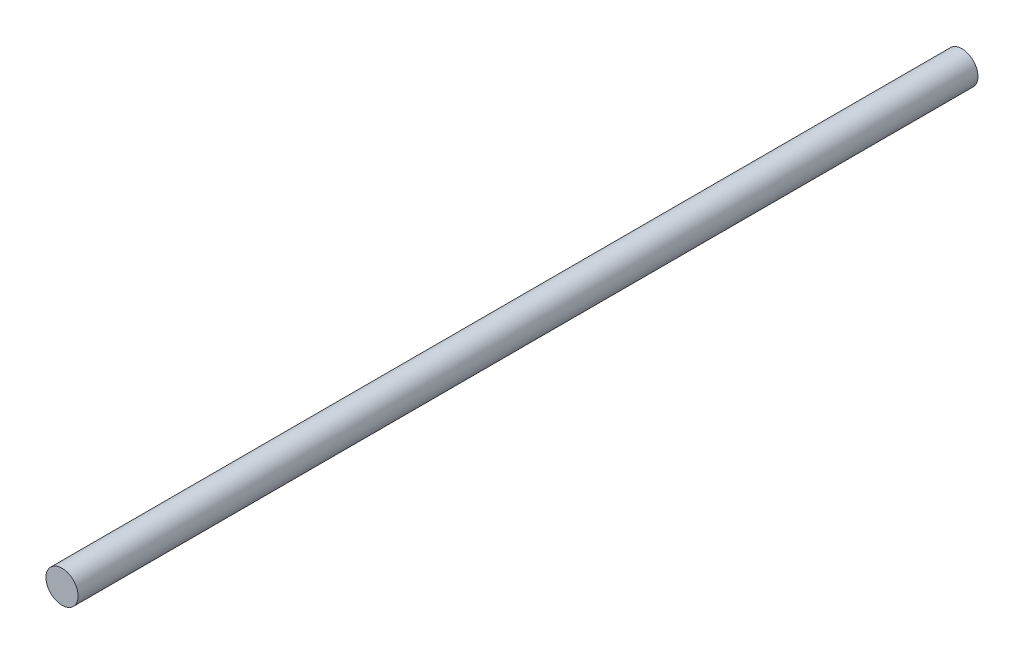
ISO-10303-21;
HEADER;
FILE_DESCRIPTION(('STEP AP214'),'2;1');
FILE_NAME('part.step','',(''),(''),'','','');
FILE_SCHEMA(('AUTOMOTIVE_DESIGN { 1 0 10303 214 1 1 1 1 }'));
ENDSEC;
DATA;
#1=APPLICATION_CONTEXT('core data for automotive mechanical design processes');
#2=APPLICATION_PROTOCOL_DEFINITION('international standard','automotive_design',2000,#1);
#3=PRODUCT_CONTEXT('',#1,'mechanical');
#4=PRODUCT('Part','Part','',(#3));
#5=PRODUCT_RELATED_PRODUCT_CATEGORY('part','',(#4));
#6=PRODUCT_DEFINITION_FORMATION('','',#4);
#7=PRODUCT_DEFINITION_CONTEXT('part definition',#1,'design');
#8=PRODUCT_DEFINITION('design','',#6,#7);
#9=PRODUCT_DEFINITION_SHAPE('','',#8);
#10=(LENGTH_UNIT() NAMED_UNIT(*) SI_UNIT(.MILLI.,.METRE.));
#11=(NAMED_UNIT(*) PLANE_ANGLE_UNIT() SI_UNIT($,.RADIAN.));
#12=(NAMED_UNIT(*) SI_UNIT($,.STERADIAN.) SOLID_ANGLE_UNIT());
#13=UNCERTAINTY_MEASURE_WITH_UNIT(LENGTH_MEASURE(1.E-05),#10,'distance_accuracy_value','');
#14=(GEOMETRIC_REPRESENTATION_CONTEXT(3) GLOBAL_UNCERTAINTY_ASSIGNED_CONTEXT((#13)) GLOBAL_UNIT_ASSIGNED_CONTEXT((#10,
#11,#12)) REPRESENTATION_CONTEXT('',''));
#15=CARTESIAN_POINT('',(0.,0.,0.));
#16=DIRECTION('',(0.,0.,1.));
#17=DIRECTION('',(1.,0.,0.));
#18=AXIS2_PLACEMENT_3D('',#15,#16,#17);
#19=CARTESIAN_POINT('',(-4.22656214703676,0.,140.));
#20=DIRECTION('',(0.,0.,-1.));
#21=DIRECTION('',(-1.,0.,0.));
#22=AXIS2_PLACEMENT_3D('',#19,#20,#21);
#23=CYLINDRICAL_SURFACE('',#22,2.5);
#24=CARTESIAN_POINT('',(-4.22656214703676,0.,140.));
#25=DIRECTION('',(0.,0.,1.));
#26=DIRECTION('',(1.,0.,0.));
#27=AXIS2_PLACEMENT_3D('',#24,#25,#26);
#28=CIRCLE('',#27,2.5);
#29=CARTESIAN_POINT('',(-1.72656214703676,0.,140.));
#30=VERTEX_POINT('',#29);
#31=EDGE_CURVE('E10',#30,#30,#28,.T.);
#32=ORIENTED_EDGE('',*,*,#31,.F.);
#33=EDGE_LOOP('',(#32));
#34=FACE_BOUND('',#33,.T.);
#35=CARTESIAN_POINT('',(-4.22656214703676,0.,0.));
#36=DIRECTION('',(0.,0.,1.));
#37=DIRECTION('',(1.,0.,0.));
#38=AXIS2_PLACEMENT_3D('',#35,#36,#37);
#39=CIRCLE('',#38,2.5);
#40=CARTESIAN_POINT('',(-1.72656214703676,0.,0.));
#41=VERTEX_POINT('',#40);
#42=EDGE_CURVE('E40',#41,#41,#39,.T.);
#43=ORIENTED_EDGE('',*,*,#42,.T.);
#44=EDGE_LOOP('',(#43));
#45=FACE_BOUND('',#44,.T.);
#46=ADVANCED_FACE('F37',(#34,#45),#23,.T.);
#47=CARTESIAN_POINT('',(-4.22656214703676,0.,140.));
#48=DIRECTION('',(0.,0.,1.));
#49=DIRECTION('',(1.,0.,0.));
#50=AXIS2_PLACEMENT_3D('',#47,#48,#49);
#51=PLANE('',#50);
#52=ORIENTED_EDGE('',*,*,#31,.T.);
#53=EDGE_LOOP('',(#52));
#54=FACE_BOUND('',#53,.T.);
#55=ADVANCED_FACE('F52',(#54),#51,.T.);
#56=CARTESIAN_POINT('',(-4.22656214703676,0.,0.));
#57=DIRECTION('',(0.,0.,1.));
#58=DIRECTION('',(1.,0.,0.));
#59=AXIS2_PLACEMENT_3D('',#56,#57,#58);
#60=PLANE('',#59);
#61=ORIENTED_EDGE('',*,*,#42,.F.);
#62=EDGE_LOOP('',(#61));
#63=FACE_BOUND('',#62,.T.);
#64=ADVANCED_FACE('F50',(#63),#60,.F.);
#65=CLOSED_SHELL('',(#46,#55,#64));
#66=MANIFOLD_SOLID_BREP('B2',#65);
#67=ADVANCED_BREP_SHAPE_REPRESENTATION('',(#18,#66),#14);
#68=SHAPE_DEFINITION_REPRESENTATION(#9,#67);
ENDSEC;
END-ISO-10303-21;
